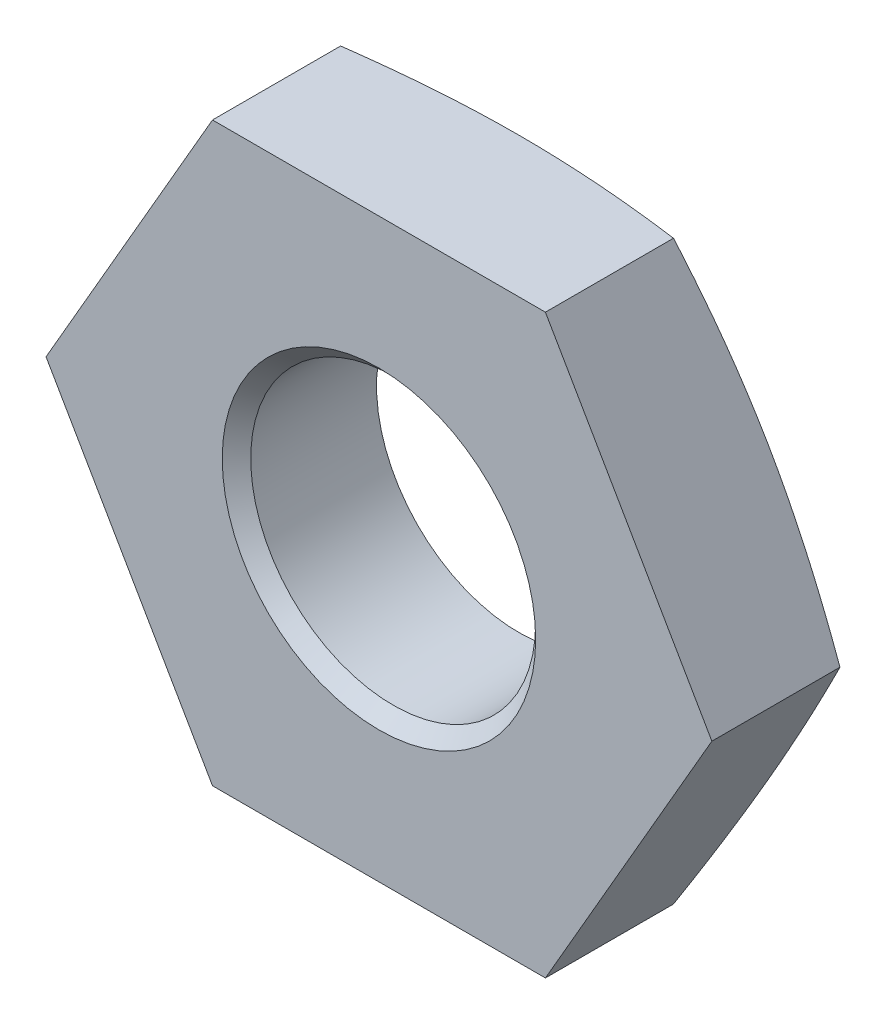
ISO-10303-21;
HEADER;
FILE_DESCRIPTION(('STEP AP214'),'2;1');
FILE_NAME('part.step','',(''),(''),'','','');
FILE_SCHEMA(('AUTOMOTIVE_DESIGN { 1 0 10303 214 1 1 1 1 }'));
ENDSEC;
DATA;
#1=APPLICATION_CONTEXT('core data for automotive mechanical design processes');
#2=APPLICATION_PROTOCOL_DEFINITION('international standard','automotive_design',2000,#1);
#3=PRODUCT_CONTEXT('',#1,'mechanical');
#4=PRODUCT('Part','Part','',(#3));
#5=PRODUCT_RELATED_PRODUCT_CATEGORY('part','',(#4));
#6=PRODUCT_DEFINITION_FORMATION('','',#4);
#7=PRODUCT_DEFINITION_CONTEXT('part definition',#1,'design');
#8=PRODUCT_DEFINITION('design','',#6,#7);
#9=PRODUCT_DEFINITION_SHAPE('','',#8);
#10=(LENGTH_UNIT() NAMED_UNIT(*) SI_UNIT(.MILLI.,.METRE.));
#11=(NAMED_UNIT(*) PLANE_ANGLE_UNIT() SI_UNIT($,.RADIAN.));
#12=(NAMED_UNIT(*) SI_UNIT($,.STERADIAN.) SOLID_ANGLE_UNIT());
#13=UNCERTAINTY_MEASURE_WITH_UNIT(LENGTH_MEASURE(1.E-05),#10,'distance_accuracy_value','');
#14=(GEOMETRIC_REPRESENTATION_CONTEXT(3) GLOBAL_UNCERTAINTY_ASSIGNED_CONTEXT((#13)) GLOBAL_UNIT_ASSIGNED_CONTEXT((#10,
#11,#12)) REPRESENTATION_CONTEXT('',''));
#15=CARTESIAN_POINT('',(0.,0.,0.));
#16=DIRECTION('',(0.,0.,1.));
#17=DIRECTION('',(1.,0.,0.));
#18=AXIS2_PLACEMENT_3D('',#15,#16,#17);
#19=CARTESIAN_POINT('',(-2.02072594216369,-3.5,-1.7));
#20=DIRECTION('',(0.,-1.,0.));
#21=DIRECTION('',(0.,0.,-1.));
#22=AXIS2_PLACEMENT_3D('',#19,#20,#21);
#23=PLANE('',#22);
#24=CARTESIAN_POINT('',(-5.34250540243529,-3.5,-0.926460153703001));
#25=CARTESIAN_POINT('',(-5.18375511671644,-3.5,-0.962032372708151));
#26=CARTESIAN_POINT('',(-5.02490552043847,-3.5,-0.997168370742541));
#27=CARTESIAN_POINT('',(-4.70695877225528,-3.5,-1.06633415335759));
#28=CARTESIAN_POINT('',(-4.5478616099486,-3.5,-1.10036389006764));
#29=CARTESIAN_POINT('',(-4.22922785596206,-3.5,-1.16711307984257));
#30=CARTESIAN_POINT('',(-4.06969098596063,-3.5,-1.1998312109674));
#31=CARTESIAN_POINT('',(-3.75028550399467,-3.5,-1.26359691073799));
#32=CARTESIAN_POINT('',(-3.59041689484826,-3.5,-1.29464449351522));
#33=CARTESIAN_POINT('',(-3.11278775858948,-3.5,-1.38424317610052));
#34=CARTESIAN_POINT('',(-2.7944536274191,-3.5,-1.4397960921004));
#35=CARTESIAN_POINT('',(-2.15584280750445,-3.5,-1.53857753520242));
#36=CARTESIAN_POINT('',(-1.83556646684102,-3.5,-1.58180820769069));
#37=CARTESIAN_POINT('',(-1.35186201394615,-3.5,-1.63326780806071));
#38=CARTESIAN_POINT('',(-1.18915391181551,-3.5,-1.64823562569859));
#39=CARTESIAN_POINT('',(-0.863327752554062,-3.5,-1.67279914319906));
#40=CARTESIAN_POINT('',(-0.700209704910771,-3.5,-1.6823949662583));
#41=CARTESIAN_POINT('',(-0.373802177523218,-3.5,-1.69565632714604));
#42=CARTESIAN_POINT('',(-0.21051280887918,-3.5,-1.69932454883453));
#43=CARTESIAN_POINT('',(0.116088611208562,-3.5,-1.70050481492705));
#44=CARTESIAN_POINT('',(0.27940066263463,-3.5,-1.69801686409105));
#45=CARTESIAN_POINT('',(0.60640968441319,-3.5,-1.68702500364934));
#46=CARTESIAN_POINT('',(0.77010590916335,-3.5,-1.67849935713373));
#47=CARTESIAN_POINT('',(1.09711815279145,-3.5,-1.65591780097622));
#48=CARTESIAN_POINT('',(1.26043415057105,-3.5,-1.64186159147595));
#49=CARTESIAN_POINT('',(1.58667719858699,-3.5,-1.60892981836055));
#50=CARTESIAN_POINT('',(1.74960393516029,-3.5,-1.59005119345729));
#51=CARTESIAN_POINT('',(2.07493184102748,-3.5,-1.54825406645032));
#52=CARTESIAN_POINT('',(2.23733300867335,-3.5,-1.52533555169116));
#53=CARTESIAN_POINT('',(2.70201244280079,-3.5,-1.45494463873053));
#54=CARTESIAN_POINT('',(3.00366965520128,-3.5,-1.40339226790375));
#55=CARTESIAN_POINT('',(3.60558094545378,-3.5,-1.29266255628891));
#56=CARTESIAN_POINT('',(3.90583484122203,-3.5,-1.2334842530017));
#57=CARTESIAN_POINT('',(4.50535507961957,-3.5,-1.11000595354002));
#58=CARTESIAN_POINT('',(4.80462116673555,-3.5,-1.04570472614207));
#59=CARTESIAN_POINT('',(5.40235855476505,-3.5,-0.913615750470934));
#60=CARTESIAN_POINT('',(5.70082990089598,-3.5,-0.845828205214062));
#61=CARTESIAN_POINT('',(6.29427282929031,-3.5,-0.708480432636206));
#62=CARTESIAN_POINT('',(6.58924997937444,-3.5,-0.638944173015077));
#63=CARTESIAN_POINT('',(7.17879272941702,-3.5,-0.49812969725047));
#64=CARTESIAN_POINT('',(7.47335832180681,-3.5,-0.426851449505792));
#65=CARTESIAN_POINT('',(8.06181238798381,-3.5,-0.283096465858741));
#66=CARTESIAN_POINT('',(8.35570124898792,-3.5,-0.210621311664311));
#67=CARTESIAN_POINT('',(8.94322286292841,-3.5,-0.0646806148985115));
#68=CARTESIAN_POINT('',(9.23685562397808,-3.5,0.00878489498778544));
#69=CARTESIAN_POINT('',(9.53039909334217,-3.5,0.0826012901986862));
#70=B_SPLINE_CURVE_WITH_KNOTS('',3,(#24,#25,#26,#27,#28,#29,#30,#31,#32,#33,#34,#35,#36,#37,#38,
#39,#40,#41,#42,#43,#44,#45,#46,#47,#48,#49,#50,#51,#52,#53,#54,#55,#56,#57,#58,#59,#60,#61,#62,
#63,#64,#65,#66,#67,#68,#69),.UNSPECIFIED.,.F.,.F.,(4,2,2,2,2,2,2,2,2,2,2,2,2,2,2,2,2,2,2,2,2,2,
4),(0.,0.488062347012476,0.976145785631088,1.46470938191903,1.95326884470765,2.92256552954151,
3.8916933500248,4.38180449892748,4.8719044075891,5.36178234983076,5.85165991329731,
6.34331015910023,6.83498706507532,7.32697686849975,7.8189682131699,8.7368879457719,
9.65492364634101,10.5731806534719,11.491384248794,12.4005642685826,13.3097607939584,
14.2178391858651,15.1258876811447),.UNSPECIFIED.);
#71=CARTESIAN_POINT('',(2.02072594216368,-3.5,-1.55491840485417));
#72=VERTEX_POINT('',#71);
#73=CARTESIAN_POINT('',(0.,-3.5,-1.7));
#74=VERTEX_POINT('',#73);
#75=EDGE_CURVE('E213',#72,#74,#70,.F.);
#76=ORIENTED_EDGE('',*,*,#75,.F.);
#77=DIRECTION('',(0.,0.,1.));
#78=VECTOR('',#77,1.);
#79=CARTESIAN_POINT('',(2.02072594216369,-3.5,-1.7));
#80=LINE('',#79,#78);
#81=CARTESIAN_POINT('',(2.02072594216369,-3.5,0.));
#82=VERTEX_POINT('',#81);
#83=EDGE_CURVE('E236',#72,#82,#80,.T.);
#84=ORIENTED_EDGE('',*,*,#83,.T.);
#85=DIRECTION('',(1.,0.,0.));
#86=VECTOR('',#85,1.);
#87=CARTESIAN_POINT('',(-2.02072594216369,-3.5,0.));
#88=LINE('',#87,#86);
#89=CARTESIAN_POINT('',(-2.02072594216369,-3.5,0.));
#90=VERTEX_POINT('',#89);
#91=EDGE_CURVE('E218',#90,#82,#88,.T.);
#92=ORIENTED_EDGE('',*,*,#91,.F.);
#93=DIRECTION('',(0.,0.,1.));
#94=VECTOR('',#93,1.);
#95=CARTESIAN_POINT('',(-2.02072594216369,-3.5,-1.7));
#96=LINE('',#95,#94);
#97=CARTESIAN_POINT('',(-2.02072594216369,-3.5,-1.55491840485417));
#98=VERTEX_POINT('',#97);
#99=EDGE_CURVE('E59',#98,#90,#96,.T.);
#100=ORIENTED_EDGE('',*,*,#99,.F.);
#101=EDGE_CURVE('E207',#74,#98,#70,.F.);
#102=ORIENTED_EDGE('',*,*,#101,.F.);
#103=EDGE_LOOP('',(#76,#84,#92,#100,#102));
#104=FACE_BOUND('',#103,.T.);
#105=ADVANCED_FACE('F36',(#104),#23,.T.);
#106=CARTESIAN_POINT('',(-4.04145188432738,0.,-1.7));
#107=DIRECTION('',(-0.866025403784439,-0.5,0.));
#108=DIRECTION('',(0.5,-0.866025403784439,0.));
#109=AXIS2_PLACEMENT_3D('',#106,#107,#108);
#110=PLANE('',#109);
#111=CARTESIAN_POINT('',(-2.02061047210985,-3.5002,-1.55488746342053));
#112=CARTESIAN_POINT('',(-2.10453570366722,-3.35483723490565,-1.57738559382202));
#113=CARTESIAN_POINT('',(-2.18861311055532,-3.20921089440683,-1.59781025450598));
#114=CARTESIAN_POINT('',(-2.35706487716359,-2.91744387601656,-1.63369455339474));
#115=CARTESIAN_POINT('',(-2.44143934349251,-2.77130301347336,-1.64915217450553));
#116=CARTESIAN_POINT('',(-2.6099736178049,-2.47939308754755,-1.67419991225358));
#117=CARTESIAN_POINT('',(-2.69413228593377,-2.33362599845102,-1.68381990209048));
#118=CARTESIAN_POINT('',(-2.86255695641052,-2.04190591193726,-1.69671933246686));
#119=CARTESIAN_POINT('',(-2.94682293482803,-1.89595295596863,-1.7));
#120=CARTESIAN_POINT('',(-3.11535489166305,-1.60404704403137,-1.7));
#121=CARTESIAN_POINT('',(-3.19962087008056,-1.45809408806274,-1.69671933246686));
#122=CARTESIAN_POINT('',(-3.3680455405573,-1.16637400154897,-1.68381990209048));
#123=CARTESIAN_POINT('',(-3.45220420868617,-1.02060691245244,-1.67419991225358));
#124=CARTESIAN_POINT('',(-3.62073848299856,-0.728696986526635,-1.64915217450553));
#125=CARTESIAN_POINT('',(-3.70511294932748,-0.582556123983436,-1.63369455339474));
#126=CARTESIAN_POINT('',(-3.87356471593575,-0.290789105593171,-1.59781025450598));
#127=CARTESIAN_POINT('',(-3.95764212282385,-0.145162765094345,-1.57738559382201));
#128=CARTESIAN_POINT('',(-4.04156735438122,0.000200000000001623,-1.55488746342053));
#129=B_SPLINE_CURVE_WITH_KNOTS('',3,(#111,#112,#113,#114,#115,#116,#117,#118,#119,#120,#121,
#122,#123,#124,#125,#126,#127,#128),.UNSPECIFIED.,.F.,.F.,(4,2,2,2,2,2,2,2,4),(0.,
0.508081243376833,1.01636855642799,1.52203235492776,2.02759827097034,2.53316418701292,
3.03882798551268,3.54711529856384,4.05519654194067),.UNSPECIFIED.);
#130=CARTESIAN_POINT('',(-3.03108891324554,-1.75,-1.7));
#131=VERTEX_POINT('',#130);
#132=EDGE_CURVE('E214',#98,#131,#129,.T.);
#133=ORIENTED_EDGE('',*,*,#132,.F.);
#134=ORIENTED_EDGE('',*,*,#99,.T.);
#135=DIRECTION('',(0.5,-0.866025403784439,0.));
#136=VECTOR('',#135,1.);
#137=CARTESIAN_POINT('',(-4.04145188432738,0.,0.));
#138=LINE('',#137,#136);
#139=CARTESIAN_POINT('',(-4.04145188432738,0.,0.));
#140=VERTEX_POINT('',#139);
#141=EDGE_CURVE('E233',#140,#90,#138,.T.);
#142=ORIENTED_EDGE('',*,*,#141,.F.);
#143=DIRECTION('',(0.,0.,1.));
#144=VECTOR('',#143,1.);
#145=CARTESIAN_POINT('',(-4.04145188432738,0.,-1.7));
#146=LINE('',#145,#144);
#147=CARTESIAN_POINT('',(-4.04145188432738,0.,-1.55491840485417));
#148=VERTEX_POINT('',#147);
#149=EDGE_CURVE('E238',#148,#140,#146,.T.);
#150=ORIENTED_EDGE('',*,*,#149,.F.);
#151=EDGE_CURVE('E118',#131,#148,#129,.T.);
#152=ORIENTED_EDGE('',*,*,#151,.F.);
#153=EDGE_LOOP('',(#133,#134,#142,#150,#152));
#154=FACE_BOUND('',#153,.T.);
#155=ADVANCED_FACE('F205',(#154),#110,.T.);
#156=CARTESIAN_POINT('',(-2.02072594216369,3.5,-1.7));
#157=DIRECTION('',(-0.866025403784439,0.5,0.));
#158=DIRECTION('',(-0.5,-0.866025403784439,0.));
#159=AXIS2_PLACEMENT_3D('',#156,#157,#158);
#160=PLANE('',#159);
#161=CARTESIAN_POINT('',(-4.04156735438122,-0.00019999999999794,-1.55488746342053));
#162=CARTESIAN_POINT('',(-3.95764212282385,0.145162765094349,-1.57738559382201));
#163=CARTESIAN_POINT('',(-3.87356471593575,0.290789105593175,-1.59781025450598));
#164=CARTESIAN_POINT('',(-3.70511294932748,0.58255612398344,-1.63369455339474));
#165=CARTESIAN_POINT('',(-3.62073848299856,0.728696986526638,-1.64915217450553));
#166=CARTESIAN_POINT('',(-3.45220420868617,1.02060691245245,-1.67419991225358));
#167=CARTESIAN_POINT('',(-3.3680455405573,1.16637400154898,-1.68381990209048));
#168=CARTESIAN_POINT('',(-3.19962087008056,1.45809408806274,-1.69671933246686));
#169=CARTESIAN_POINT('',(-3.11535489166305,1.60404704403137,-1.7));
#170=CARTESIAN_POINT('',(-2.94682293482803,1.89595295596863,-1.7));
#171=CARTESIAN_POINT('',(-2.86255695641052,2.04190591193726,-1.69671933246686));
#172=CARTESIAN_POINT('',(-2.69413228593377,2.33362599845103,-1.68381990209048));
#173=CARTESIAN_POINT('',(-2.6099736178049,2.47939308754756,-1.67419991225358));
#174=CARTESIAN_POINT('',(-2.44143934349251,2.77130301347336,-1.64915217450553));
#175=CARTESIAN_POINT('',(-2.35706487716359,2.91744387601656,-1.63369455339474));
#176=CARTESIAN_POINT('',(-2.18861311055532,3.20921089440683,-1.59781025450598));
#177=CARTESIAN_POINT('',(-2.10453570366722,3.35483723490565,-1.57738559382201));
#178=CARTESIAN_POINT('',(-2.02061047210985,3.5002,-1.55488746342053));
#179=B_SPLINE_CURVE_WITH_KNOTS('',3,(#161,#162,#163,#164,#165,#166,#167,#168,#169,#170,#171,
#172,#173,#174,#175,#176,#177,#178),.UNSPECIFIED.,.F.,.F.,(4,2,2,2,2,2,2,2,4),(0.,
0.508081243376834,1.01636855642799,1.52203235492776,2.02759827097034,2.53316418701292,
3.03882798551268,3.54711529856384,4.05519654194067),.UNSPECIFIED.);
#180=CARTESIAN_POINT('',(-3.03108891324554,1.75,-1.7));
#181=VERTEX_POINT('',#180);
#182=EDGE_CURVE('E111',#148,#181,#179,.T.);
#183=ORIENTED_EDGE('',*,*,#182,.F.);
#184=ORIENTED_EDGE('',*,*,#149,.T.);
#185=DIRECTION('',(-0.5,-0.866025403784438,0.));
#186=VECTOR('',#185,1.);
#187=CARTESIAN_POINT('',(-2.02072594216369,3.5,0.));
#188=LINE('',#187,#186);
#189=CARTESIAN_POINT('',(-2.02072594216369,3.5,0.));
#190=VERTEX_POINT('',#189);
#191=EDGE_CURVE('E230',#190,#140,#188,.T.);
#192=ORIENTED_EDGE('',*,*,#191,.F.);
#193=DIRECTION('',(0.,0.,1.));
#194=VECTOR('',#193,1.);
#195=CARTESIAN_POINT('',(-2.02072594216369,3.5,-1.7));
#196=LINE('',#195,#194);
#197=CARTESIAN_POINT('',(-2.02072594216369,3.5,-1.55491840485417));
#198=VERTEX_POINT('',#197);
#199=EDGE_CURVE('E142',#198,#190,#196,.T.);
#200=ORIENTED_EDGE('',*,*,#199,.F.);
#201=EDGE_CURVE('E122',#181,#198,#179,.T.);
#202=ORIENTED_EDGE('',*,*,#201,.F.);
#203=EDGE_LOOP('',(#183,#184,#192,#200,#202));
#204=FACE_BOUND('',#203,.T.);
#205=ADVANCED_FACE('F140',(#204),#160,.T.);
#206=CARTESIAN_POINT('',(2.02072594216369,3.5,-1.7));
#207=DIRECTION('',(0.,1.,0.));
#208=DIRECTION('',(0.,0.,1.));
#209=AXIS2_PLACEMENT_3D('',#206,#207,#208);
#210=PLANE('',#209);
#211=CARTESIAN_POINT('',(-5.34250540243529,3.5,-0.926460153703));
#212=CARTESIAN_POINT('',(-5.18375511671645,3.5,-0.962032372708149));
#213=CARTESIAN_POINT('',(-5.02490552043847,3.5,-0.997168370742539));
#214=CARTESIAN_POINT('',(-4.70695877225528,3.5,-1.06633415335759));
#215=CARTESIAN_POINT('',(-4.5478616099486,3.5,-1.10036389006764));
#216=CARTESIAN_POINT('',(-4.22922785596207,3.5,-1.16711307984257));
#217=CARTESIAN_POINT('',(-4.06969098596063,3.5,-1.1998312109674));
#218=CARTESIAN_POINT('',(-3.75028550399467,3.5,-1.26359691073799));
#219=CARTESIAN_POINT('',(-3.59041689484826,3.5,-1.29464449351522));
#220=CARTESIAN_POINT('',(-3.11278775858948,3.5,-1.38424317610052));
#221=CARTESIAN_POINT('',(-2.7944536274191,3.5,-1.4397960921004));
#222=CARTESIAN_POINT('',(-2.15584280750445,3.5,-1.53857753520242));
#223=CARTESIAN_POINT('',(-1.83556646684103,3.5,-1.58180820769069));
#224=CARTESIAN_POINT('',(-1.35186201394615,3.5,-1.63326780806071));
#225=CARTESIAN_POINT('',(-1.18915391181551,3.5,-1.64823562569858));
#226=CARTESIAN_POINT('',(-0.863327752554063,3.5,-1.67279914319906));
#227=CARTESIAN_POINT('',(-0.700209704910772,3.5,-1.68239496625829));
#228=CARTESIAN_POINT('',(-0.373802177523219,3.5,-1.69565632714604));
#229=CARTESIAN_POINT('',(-0.210512808879181,3.5,-1.69932454883453));
#230=CARTESIAN_POINT('',(0.116088611208562,3.5,-1.70050481492704));
#231=CARTESIAN_POINT('',(0.27940066263463,3.5,-1.69801686409105));
#232=CARTESIAN_POINT('',(0.606409684413191,3.5,-1.68702500364934));
#233=CARTESIAN_POINT('',(0.770105909163351,3.5,-1.67849935713373));
#234=CARTESIAN_POINT('',(1.09711815279145,3.5,-1.65591780097622));
#235=CARTESIAN_POINT('',(1.26043415057105,3.5,-1.64186159147595));
#236=CARTESIAN_POINT('',(1.58667719858699,3.5,-1.60892981836055));
#237=CARTESIAN_POINT('',(1.74960393516029,3.5,-1.59005119345729));
#238=CARTESIAN_POINT('',(2.07493184102749,3.5,-1.54825406645032));
#239=CARTESIAN_POINT('',(2.23733300867335,3.5,-1.52533555169116));
#240=CARTESIAN_POINT('',(2.7020124428008,3.5,-1.45494463873052));
#241=CARTESIAN_POINT('',(3.00366965520129,3.5,-1.40339226790375));
#242=CARTESIAN_POINT('',(3.60558094545379,3.5,-1.29266255628891));
#243=CARTESIAN_POINT('',(3.90583484122204,3.5,-1.2334842530017));
#244=CARTESIAN_POINT('',(4.50535507961957,3.5,-1.11000595354002));
#245=CARTESIAN_POINT('',(4.80462116673556,3.5,-1.04570472614207));
#246=CARTESIAN_POINT('',(5.40235855476505,3.5,-0.913615750470932));
#247=CARTESIAN_POINT('',(5.70082990089599,3.5,-0.84582820521406));
#248=CARTESIAN_POINT('',(6.29427282929031,3.5,-0.708480432636204));
#249=CARTESIAN_POINT('',(6.58924997937445,3.5,-0.638944173015075));
#250=CARTESIAN_POINT('',(7.17879272941703,3.5,-0.498129697250468));
#251=CARTESIAN_POINT('',(7.47335832180682,3.5,-0.426851449505791));
#252=CARTESIAN_POINT('',(8.06181238798382,3.5,-0.28309646585874));
#253=CARTESIAN_POINT('',(8.35570124898793,3.5,-0.21062131166431));
#254=CARTESIAN_POINT('',(8.94322286292842,3.5,-0.0646806148985103));
#255=CARTESIAN_POINT('',(9.23685562397808,3.5,0.00878489498778664));
#256=CARTESIAN_POINT('',(9.53039909334217,3.5,0.0826012901986869));
#257=B_SPLINE_CURVE_WITH_KNOTS('',3,(#211,#212,#213,#214,#215,#216,#217,#218,#219,#220,#221,
#222,#223,#224,#225,#226,#227,#228,#229,#230,#231,#232,#233,#234,#235,#236,#237,#238,#239,#240,
#241,#242,#243,#244,#245,#246,#247,#248,#249,#250,#251,#252,#253,#254,#255,#256),.UNSPECIFIED.,
.F.,.F.,(4,2,2,2,2,2,2,2,2,2,2,2,2,2,2,2,2,2,2,2,2,2,4),(0.,0.488062347012478,0.97614578563109,
1.46470938191903,1.95326884470766,2.92256552954152,3.8916933500248,4.38180449892748,
4.8719044075891,5.36178234983076,5.85165991329732,6.34331015910024,6.83498706507533,
7.32697686849975,7.81896821316991,8.73688794577191,9.65492364634102,10.5731806534719,
11.491384248794,12.4005642685826,13.3097607939584,14.2178391858651,15.1258876811447),.UNSPECIFIED.);
#258=CARTESIAN_POINT('',(0.,3.5,-1.7));
#259=VERTEX_POINT('',#258);
#260=EDGE_CURVE('E129',#198,#259,#257,.T.);
#261=ORIENTED_EDGE('',*,*,#260,.F.);
#262=ORIENTED_EDGE('',*,*,#199,.T.);
#263=DIRECTION('',(-1.,0.,0.));
#264=VECTOR('',#263,1.);
#265=CARTESIAN_POINT('',(2.02072594216369,3.5,0.));
#266=LINE('',#265,#264);
#267=CARTESIAN_POINT('',(2.02072594216369,3.5,0.));
#268=VERTEX_POINT('',#267);
#269=EDGE_CURVE('E227',#268,#190,#266,.T.);
#270=ORIENTED_EDGE('',*,*,#269,.F.);
#271=DIRECTION('',(0.,0.,1.));
#272=VECTOR('',#271,1.);
#273=CARTESIAN_POINT('',(2.02072594216369,3.5,-1.7));
#274=LINE('',#273,#272);
#275=CARTESIAN_POINT('',(2.02072594216368,3.50000000000001,-1.55491840485417));
#276=VERTEX_POINT('',#275);
#277=EDGE_CURVE('E241',#276,#268,#274,.T.);
#278=ORIENTED_EDGE('',*,*,#277,.F.);
#279=EDGE_CURVE('E143',#259,#276,#257,.T.);
#280=ORIENTED_EDGE('',*,*,#279,.F.);
#281=EDGE_LOOP('',(#261,#262,#270,#278,#280));
#282=FACE_BOUND('',#281,.T.);
#283=ADVANCED_FACE('F197',(#282),#210,.T.);
#284=CARTESIAN_POINT('',(4.04145188432738,0.,-1.7));
#285=DIRECTION('',(0.866025403784439,0.5,0.));
#286=DIRECTION('',(-0.5,0.866025403784438,0.));
#287=AXIS2_PLACEMENT_3D('',#284,#285,#286);
#288=PLANE('',#287);
#289=CARTESIAN_POINT('',(2.02061047210985,3.5002,-1.55488746342053));
#290=CARTESIAN_POINT('',(2.10453570366722,3.35483723490566,-1.57738559382202));
#291=CARTESIAN_POINT('',(2.18861311055531,3.20921089440683,-1.59781025450598));
#292=CARTESIAN_POINT('',(2.35706487716359,2.91744387601656,-1.63369455339474));
#293=CARTESIAN_POINT('',(2.44143934349251,2.77130301347336,-1.64915217450553));
#294=CARTESIAN_POINT('',(2.6099736178049,2.47939308754756,-1.67419991225359));
#295=CARTESIAN_POINT('',(2.69413228593377,2.33362599845102,-1.68381990209048));
#296=CARTESIAN_POINT('',(2.86255695641051,2.04190591193726,-1.69671933246686));
#297=CARTESIAN_POINT('',(2.94682293482802,1.89595295596863,-1.7));
#298=CARTESIAN_POINT('',(3.11535489166304,1.60404704403137,-1.7));
#299=CARTESIAN_POINT('',(3.19962087008055,1.45809408806274,-1.69671933246686));
#300=CARTESIAN_POINT('',(3.36804554055729,1.16637400154898,-1.68381990209048));
#301=CARTESIAN_POINT('',(3.45220420868616,1.02060691245245,-1.67419991225359));
#302=CARTESIAN_POINT('',(3.62073848299855,0.728696986526638,-1.64915217450553));
#303=CARTESIAN_POINT('',(3.70511294932747,0.582556123983439,-1.63369455339474));
#304=CARTESIAN_POINT('',(3.87356471593575,0.290789105593174,-1.59781025450598));
#305=CARTESIAN_POINT('',(3.95764212282385,0.145162765094348,-1.57738559382202));
#306=CARTESIAN_POINT('',(4.04156735438121,-0.000199999999999039,-1.55488746342053));
#307=B_SPLINE_CURVE_WITH_KNOTS('',3,(#289,#290,#291,#292,#293,#294,#295,#296,#297,#298,#299,
#300,#301,#302,#303,#304,#305,#306),.UNSPECIFIED.,.F.,.F.,(4,2,2,2,2,2,2,2,4),(0.,
0.508081243376833,1.016368556428,1.52203235492776,2.02759827097034,2.53316418701292,
3.03882798551268,3.54711529856384,4.05519654194067),.UNSPECIFIED.);
#308=CARTESIAN_POINT('',(3.03108891324553,1.75,-1.7));
#309=VERTEX_POINT('',#308);
#310=EDGE_CURVE('E191',#276,#309,#307,.T.);
#311=ORIENTED_EDGE('',*,*,#310,.F.);
#312=ORIENTED_EDGE('',*,*,#277,.T.);
#313=DIRECTION('',(-0.5,0.866025403784439,0.));
#314=VECTOR('',#313,1.);
#315=CARTESIAN_POINT('',(4.04145188432738,0.,0.));
#316=LINE('',#315,#314);
#317=CARTESIAN_POINT('',(4.04145188432738,0.,0.));
#318=VERTEX_POINT('',#317);
#319=EDGE_CURVE('E224',#318,#268,#316,.T.);
#320=ORIENTED_EDGE('',*,*,#319,.F.);
#321=DIRECTION('',(0.,0.,1.));
#322=VECTOR('',#321,1.);
#323=CARTESIAN_POINT('',(4.04145188432738,0.,-1.7));
#324=LINE('',#323,#322);
#325=CARTESIAN_POINT('',(4.04145188432738,0.,-1.55491840485417));
#326=VERTEX_POINT('',#325);
#327=EDGE_CURVE('E243',#326,#318,#324,.T.);
#328=ORIENTED_EDGE('',*,*,#327,.F.);
#329=EDGE_CURVE('E184',#309,#326,#307,.T.);
#330=ORIENTED_EDGE('',*,*,#329,.F.);
#331=EDGE_LOOP('',(#311,#312,#320,#328,#330));
#332=FACE_BOUND('',#331,.T.);
#333=ADVANCED_FACE('F193',(#332),#288,.T.);
#334=CARTESIAN_POINT('',(2.02072594216369,-3.5,-1.7));
#335=DIRECTION('',(0.866025403784439,-0.5,0.));
#336=DIRECTION('',(0.5,0.866025403784439,0.));
#337=AXIS2_PLACEMENT_3D('',#334,#335,#336);
#338=PLANE('',#337);
#339=CARTESIAN_POINT('',(4.04156735438122,0.000200000000000062,-1.55488746342053));
#340=CARTESIAN_POINT('',(3.95764212282385,-0.145162765094347,-1.57738559382202));
#341=CARTESIAN_POINT('',(3.87356471593575,-0.290789105593173,-1.59781025450598));
#342=CARTESIAN_POINT('',(3.70511294932748,-0.582556123983438,-1.63369455339474));
#343=CARTESIAN_POINT('',(3.62073848299856,-0.728696986526636,-1.64915217450553));
#344=CARTESIAN_POINT('',(3.45220420868617,-1.02060691245244,-1.67419991225359));
#345=CARTESIAN_POINT('',(3.3680455405573,-1.16637400154898,-1.68381990209048));
#346=CARTESIAN_POINT('',(3.19962087008055,-1.45809408806274,-1.69671933246686));
#347=CARTESIAN_POINT('',(3.11535489166304,-1.60404704403137,-1.7));
#348=CARTESIAN_POINT('',(2.94682293482802,-1.89595295596863,-1.7));
#349=CARTESIAN_POINT('',(2.86255695641051,-2.04190591193726,-1.69671933246686));
#350=CARTESIAN_POINT('',(2.69413228593377,-2.33362599845102,-1.68381990209048));
#351=CARTESIAN_POINT('',(2.6099736178049,-2.47939308754755,-1.67419991225359));
#352=CARTESIAN_POINT('',(2.44143934349251,-2.77130301347336,-1.64915217450553));
#353=CARTESIAN_POINT('',(2.35706487716359,-2.91744387601656,-1.63369455339474));
#354=CARTESIAN_POINT('',(2.18861311055532,-3.20921089440682,-1.59781025450598));
#355=CARTESIAN_POINT('',(2.10453570366722,-3.35483723490565,-1.57738559382202));
#356=CARTESIAN_POINT('',(2.02061047210985,-3.5002,-1.55488746342053));
#357=B_SPLINE_CURVE_WITH_KNOTS('',3,(#339,#340,#341,#342,#343,#344,#345,#346,#347,#348,#349,
#350,#351,#352,#353,#354,#355,#356),.UNSPECIFIED.,.F.,.F.,(4,2,2,2,2,2,2,2,4),(0.,
0.508081243376833,1.01636855642799,1.52203235492776,2.02759827097033,2.53316418701291,
3.03882798551268,3.54711529856384,4.05519654194067),.UNSPECIFIED.);
#358=CARTESIAN_POINT('',(3.03108891324553,-1.75,-1.7));
#359=VERTEX_POINT('',#358);
#360=EDGE_CURVE('E192',#326,#359,#357,.T.);
#361=ORIENTED_EDGE('',*,*,#360,.F.);
#362=ORIENTED_EDGE('',*,*,#327,.T.);
#363=DIRECTION('',(0.5,0.866025403784438,0.));
#364=VECTOR('',#363,1.);
#365=CARTESIAN_POINT('',(2.02072594216369,-3.5,0.));
#366=LINE('',#365,#364);
#367=EDGE_CURVE('E221',#82,#318,#366,.T.);
#368=ORIENTED_EDGE('',*,*,#367,.F.);
#369=ORIENTED_EDGE('',*,*,#83,.F.);
#370=EDGE_CURVE('E132',#359,#72,#357,.T.);
#371=ORIENTED_EDGE('',*,*,#370,.F.);
#372=EDGE_LOOP('',(#361,#362,#368,#369,#371));
#373=FACE_BOUND('',#372,.T.);
#374=ADVANCED_FACE('F196',(#373),#338,.T.);
#375=CARTESIAN_POINT('',(2.02072594216369,-3.5,-1.7));
#376=DIRECTION('',(0.,0.,1.));
#377=DIRECTION('',(1.,0.,0.));
#378=AXIS2_PLACEMENT_3D('',#375,#376,#377);
#379=PLANE('',#378);
#380=CARTESIAN_POINT('',(0.,0.,-1.7));
#381=DIRECTION('',(0.,0.,1.));
#382=DIRECTION('',(1.,0.,0.));
#383=AXIS2_PLACEMENT_3D('',#380,#381,#382);
#384=CIRCLE('',#383,1.7295);
#385=CARTESIAN_POINT('',(1.7295,0.,-1.7));
#386=VERTEX_POINT('',#385);
#387=EDGE_CURVE('E215',#386,#386,#384,.T.);
#388=ORIENTED_EDGE('',*,*,#387,.T.);
#389=EDGE_LOOP('',(#388));
#390=FACE_BOUND('',#389,.T.);
#391=CARTESIAN_POINT('',(0.,0.,-1.7));
#392=DIRECTION('',(0.,0.,1.));
#393=DIRECTION('',(1.,0.,0.));
#394=AXIS2_PLACEMENT_3D('',#391,#392,#393);
#395=CIRCLE('',#394,3.5);
#396=EDGE_CURVE('E51',#309,#359,#395,.F.);
#397=ORIENTED_EDGE('',*,*,#396,.T.);
#398=EDGE_CURVE('E245',#359,#74,#395,.F.);
#399=ORIENTED_EDGE('',*,*,#398,.T.);
#400=EDGE_CURVE('E136',#74,#131,#395,.F.);
#401=ORIENTED_EDGE('',*,*,#400,.T.);
#402=EDGE_CURVE('E115',#131,#181,#395,.F.);
#403=ORIENTED_EDGE('',*,*,#402,.T.);
#404=CARTESIAN_POINT('',(0.,0.,-1.7));
#405=DIRECTION('',(0.,0.,-1.));
#406=DIRECTION('',(-1.,0.,0.));
#407=AXIS2_PLACEMENT_3D('',#404,#405,#406);
#408=CIRCLE('',#407,3.5);
#409=EDGE_CURVE('E126',#181,#259,#408,.T.);
#410=ORIENTED_EDGE('',*,*,#409,.T.);
#411=EDGE_CURVE('E137',#259,#309,#395,.F.);
#412=ORIENTED_EDGE('',*,*,#411,.T.);
#413=EDGE_LOOP('',(#397,#399,#401,#403,#410,#412));
#414=FACE_BOUND('',#413,.T.);
#415=ADVANCED_FACE('F134',(#390,#414),#379,.F.);
#416=CARTESIAN_POINT('',(2.02072594216369,-3.5,0.));
#417=DIRECTION('',(0.,0.,1.));
#418=DIRECTION('',(1.,0.,0.));
#419=AXIS2_PLACEMENT_3D('',#416,#417,#418);
#420=PLANE('',#419);
#421=CARTESIAN_POINT('',(0.,0.,0.));
#422=DIRECTION('',(0.,0.,1.));
#423=DIRECTION('',(1.,0.,0.));
#424=AXIS2_PLACEMENT_3D('',#421,#422,#423);
#425=CIRCLE('',#424,1.90245);
#426=CARTESIAN_POINT('',(1.90245,0.,0.));
#427=VERTEX_POINT('',#426);
#428=EDGE_CURVE('E11',#427,#427,#425,.F.);
#429=ORIENTED_EDGE('',*,*,#428,.T.);
#430=EDGE_LOOP('',(#429));
#431=FACE_BOUND('',#430,.T.);
#432=ORIENTED_EDGE('',*,*,#91,.T.);
#433=ORIENTED_EDGE('',*,*,#367,.T.);
#434=ORIENTED_EDGE('',*,*,#319,.T.);
#435=ORIENTED_EDGE('',*,*,#269,.T.);
#436=ORIENTED_EDGE('',*,*,#191,.T.);
#437=ORIENTED_EDGE('',*,*,#141,.T.);
#438=EDGE_LOOP('',(#432,#433,#434,#435,#436,#437));
#439=FACE_BOUND('',#438,.T.);
#440=ADVANCED_FACE('F258',(#431,#439),#420,.T.);
#441=CARTESIAN_POINT('',(0.,0.,-1.7));
#442=DIRECTION('',(0.,0.,1.));
#443=DIRECTION('',(1.,0.,0.));
#444=AXIS2_PLACEMENT_3D('',#441,#442,#443);
#445=CYLINDRICAL_SURFACE('',#444,1.7295);
#446=CARTESIAN_POINT('',(0.,0.,-0.172949999999998));
#447=DIRECTION('',(0.,0.,1.));
#448=DIRECTION('',(1.,0.,0.));
#449=AXIS2_PLACEMENT_3D('',#446,#447,#448);
#450=CIRCLE('',#449,1.7295);
#451=CARTESIAN_POINT('',(1.7295,0.,-0.172949999999998));
#452=VERTEX_POINT('',#451);
#453=EDGE_CURVE('E44',#452,#452,#450,.T.);
#454=ORIENTED_EDGE('',*,*,#453,.T.);
#455=EDGE_LOOP('',(#454));
#456=FACE_BOUND('',#455,.T.);
#457=ORIENTED_EDGE('',*,*,#387,.F.);
#458=EDGE_LOOP('',(#457));
#459=FACE_BOUND('',#458,.T.);
#460=ADVANCED_FACE('F170',(#456,#459),#445,.F.);
#461=CARTESIAN_POINT('',(0.,0.,-1.55491840485417));
#462=DIRECTION('',(0.,0.,1.));
#463=DIRECTION('',(1.,0.,0.));
#464=AXIS2_PLACEMENT_3D('',#461,#462,#463);
#465=CONICAL_SURFACE('',#464,4.04145188432738,1.30899693899575);
#466=ORIENTED_EDGE('',*,*,#329,.T.);
#467=ORIENTED_EDGE('',*,*,#360,.T.);
#468=ORIENTED_EDGE('',*,*,#396,.F.);
#469=EDGE_LOOP('',(#466,#467,#468));
#470=FACE_BOUND('',#469,.T.);
#471=ADVANCED_FACE('F165',(#470),#465,.T.);
#472=ORIENTED_EDGE('',*,*,#279,.T.);
#473=ORIENTED_EDGE('',*,*,#310,.T.);
#474=ORIENTED_EDGE('',*,*,#411,.F.);
#475=EDGE_LOOP('',(#472,#473,#474));
#476=FACE_BOUND('',#475,.T.);
#477=ADVANCED_FACE('F169',(#476),#465,.T.);
#478=ORIENTED_EDGE('',*,*,#201,.T.);
#479=ORIENTED_EDGE('',*,*,#260,.T.);
#480=ORIENTED_EDGE('',*,*,#409,.F.);
#481=EDGE_LOOP('',(#478,#479,#480));
#482=FACE_BOUND('',#481,.T.);
#483=ADVANCED_FACE('F127',(#482),#465,.T.);
#484=ORIENTED_EDGE('',*,*,#151,.T.);
#485=ORIENTED_EDGE('',*,*,#182,.T.);
#486=ORIENTED_EDGE('',*,*,#402,.F.);
#487=EDGE_LOOP('',(#484,#485,#486));
#488=FACE_BOUND('',#487,.T.);
#489=ADVANCED_FACE('F113',(#488),#465,.T.);
#490=ORIENTED_EDGE('',*,*,#101,.T.);
#491=ORIENTED_EDGE('',*,*,#132,.T.);
#492=ORIENTED_EDGE('',*,*,#400,.F.);
#493=EDGE_LOOP('',(#490,#491,#492));
#494=FACE_BOUND('',#493,.T.);
#495=ADVANCED_FACE('F256',(#494),#465,.T.);
#496=ORIENTED_EDGE('',*,*,#75,.T.);
#497=ORIENTED_EDGE('',*,*,#398,.F.);
#498=ORIENTED_EDGE('',*,*,#370,.T.);
#499=EDGE_LOOP('',(#496,#497,#498));
#500=FACE_BOUND('',#499,.T.);
#501=ADVANCED_FACE('F172',(#500),#465,.T.);
#502=CARTESIAN_POINT('',(0.,0.,-0.172949999999998));
#503=DIRECTION('',(0.,0.,1.));
#504=DIRECTION('',(1.,0.,0.));
#505=AXIS2_PLACEMENT_3D('',#502,#503,#504);
#506=CONICAL_SURFACE('',#505,1.7295,0.785398163397451);
#507=ORIENTED_EDGE('',*,*,#428,.F.);
#508=EDGE_LOOP('',(#507));
#509=FACE_BOUND('',#508,.T.);
#510=ORIENTED_EDGE('',*,*,#453,.F.);
#511=EDGE_LOOP('',(#510));
#512=FACE_BOUND('',#511,.T.);
#513=ADVANCED_FACE('F38',(#509,#512),#506,.F.);
#514=CLOSED_SHELL('',(#105,#155,#205,#283,#333,#374,#415,#440,#460,#471,#477,#483,#489,#495,
#501,#513));
#515=MANIFOLD_SOLID_BREP('B2',#514);
#516=ADVANCED_BREP_SHAPE_REPRESENTATION('',(#18,#515),#14);
#517=SHAPE_DEFINITION_REPRESENTATION(#9,#516);
ENDSEC;
END-ISO-10303-21;
